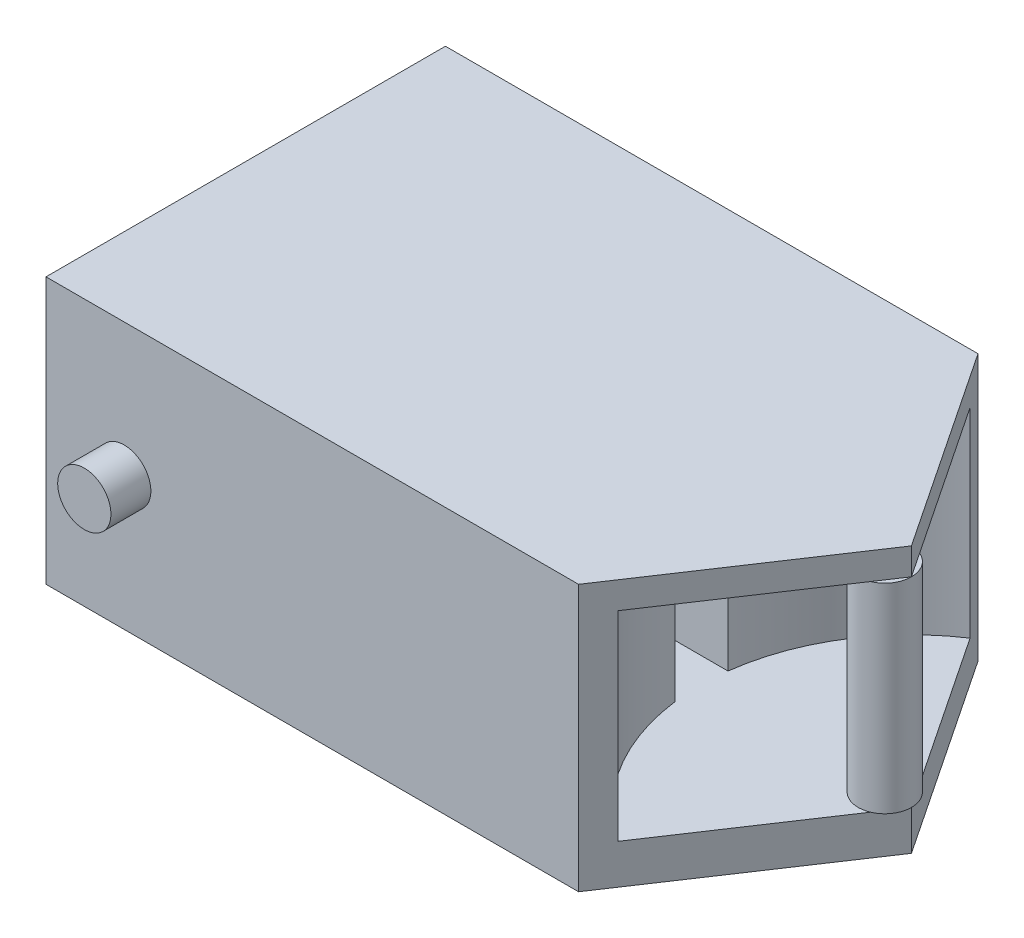
ISO-10303-21;
HEADER;
FILE_DESCRIPTION(('STEP AP214'),'2;1');
FILE_NAME('part.step','',(''),(''),'','','');
FILE_SCHEMA(('AUTOMOTIVE_DESIGN { 1 0 10303 214 1 1 1 1 }'));
ENDSEC;
DATA;
#1=APPLICATION_CONTEXT('core data for automotive mechanical design processes');
#2=APPLICATION_PROTOCOL_DEFINITION('international standard','automotive_design',2000,#1);
#3=PRODUCT_CONTEXT('',#1,'mechanical');
#4=PRODUCT('Part','Part','',(#3));
#5=PRODUCT_RELATED_PRODUCT_CATEGORY('part','',(#4));
#6=PRODUCT_DEFINITION_FORMATION('','',#4);
#7=PRODUCT_DEFINITION_CONTEXT('part definition',#1,'design');
#8=PRODUCT_DEFINITION('design','',#6,#7);
#9=PRODUCT_DEFINITION_SHAPE('','',#8);
#10=(LENGTH_UNIT() NAMED_UNIT(*) SI_UNIT(.MILLI.,.METRE.));
#11=(NAMED_UNIT(*) PLANE_ANGLE_UNIT() SI_UNIT($,.RADIAN.));
#12=(NAMED_UNIT(*) SI_UNIT($,.STERADIAN.) SOLID_ANGLE_UNIT());
#13=UNCERTAINTY_MEASURE_WITH_UNIT(LENGTH_MEASURE(1.E-05),#10,'distance_accuracy_value','');
#14=(GEOMETRIC_REPRESENTATION_CONTEXT(3) GLOBAL_UNCERTAINTY_ASSIGNED_CONTEXT((#13)) GLOBAL_UNIT_ASSIGNED_CONTEXT((#10,
#11,#12)) REPRESENTATION_CONTEXT('',''));
#15=CARTESIAN_POINT('',(0.,0.,0.));
#16=DIRECTION('',(0.,0.,1.));
#17=DIRECTION('',(1.,0.,0.));
#18=AXIS2_PLACEMENT_3D('',#15,#16,#17);
#19=CARTESIAN_POINT('',(300.,-100.,0.));
#20=DIRECTION('',(0.,-1.,0.));
#21=DIRECTION('',(0.,0.,-1.));
#22=AXIS2_PLACEMENT_3D('',#19,#20,#21);
#23=CYLINDRICAL_SURFACE('',#22,158.843097624042);
#24=CARTESIAN_POINT('',(300.,79.8602968881057,0.));
#25=DIRECTION('',(0.,-1.,0.));
#26=DIRECTION('',(0.,0.,-1.));
#27=AXIS2_PLACEMENT_3D('',#24,#25,#26);
#28=CIRCLE('',#27,158.843097624042);
#29=CARTESIAN_POINT('',(142.400642846482,79.8602968881057,-19.8386563960104));
#30=VERTEX_POINT('',#29);
#31=CARTESIAN_POINT('',(211.88970257892,79.8602968881057,-132.165446131619));
#32=VERTEX_POINT('',#31);
#33=EDGE_CURVE('E178',#30,#32,#28,.T.);
#34=ORIENTED_EDGE('',*,*,#33,.F.);
#35=DIRECTION('',(0.,-1.,0.));
#36=VECTOR('',#35,1.);
#37=CARTESIAN_POINT('',(142.400642846482,-100.,-19.8386563960104));
#38=LINE('',#37,#36);
#39=CARTESIAN_POINT('',(142.400642846482,-70.1397031118943,-19.8386563960104));
#40=VERTEX_POINT('',#39);
#41=EDGE_CURVE('E303',#30,#40,#38,.T.);
#42=ORIENTED_EDGE('',*,*,#41,.T.);
#43=CARTESIAN_POINT('',(300.,-70.1397031118943,0.));
#44=DIRECTION('',(0.,-1.,0.));
#45=DIRECTION('',(0.,0.,-1.));
#46=AXIS2_PLACEMENT_3D('',#43,#44,#45);
#47=CIRCLE('',#46,158.843097624042);
#48=CARTESIAN_POINT('',(211.88970257892,-70.1397031118943,-132.165446131619));
#49=VERTEX_POINT('',#48);
#50=EDGE_CURVE('E170',#40,#49,#47,.T.);
#51=ORIENTED_EDGE('',*,*,#50,.T.);
#52=DIRECTION('',(0.,1.,0.));
#53=VECTOR('',#52,1.);
#54=CARTESIAN_POINT('',(211.88970257892,79.8602968881057,-132.165446131619));
#55=LINE('',#54,#53);
#56=EDGE_CURVE('E287',#49,#32,#55,.T.);
#57=ORIENTED_EDGE('',*,*,#56,.T.);
#58=EDGE_LOOP('',(#34,#42,#51,#57));
#59=FACE_BOUND('',#58,.T.);
#60=ADVANCED_FACE('F39',(#59),#23,.F.);
#61=CARTESIAN_POINT('',(300.,-100.,0.));
#62=DIRECTION('',(0.832050294337844,0.,0.554700196225229));
#63=DIRECTION('',(0.554700196225229,0.,-0.832050294337844));
#64=AXIS2_PLACEMENT_3D('',#61,#62,#63);
#65=PLANE('',#64);
#66=DIRECTION('',(0.,1.,0.));
#67=VECTOR('',#66,1.);
#68=CARTESIAN_POINT('',(300.,-100.,0.));
#69=LINE('',#68,#67);
#70=CARTESIAN_POINT('',(300.,-100.,0.));
#71=VERTEX_POINT('',#70);
#72=CARTESIAN_POINT('',(300.,-70.1397031118943,0.));
#73=VERTEX_POINT('',#72);
#74=EDGE_CURVE('E168',#71,#73,#69,.T.);
#75=ORIENTED_EDGE('',*,*,#74,.T.);
#76=DIRECTION('',(-0.55470019692287,0.,0.83205029387275));
#77=VECTOR('',#76,1.);
#78=CARTESIAN_POINT('',(286.774229052692,-70.1397031118943,19.8386563849212));
#79=LINE('',#78,#77);
#80=CARTESIAN_POINT('',(287.692307661349,-70.1397031118943,18.4615384744378));
#81=VERTEX_POINT('',#80);
#82=EDGE_CURVE('E150',#73,#81,#79,.T.);
#83=ORIENTED_EDGE('',*,*,#82,.T.);
#84=CARTESIAN_POINT('',(211.889702628172,-70.1397031118943,132.165446057742));
#85=VERTEX_POINT('',#84);
#86=EDGE_CURVE('E155',#81,#85,#79,.T.);
#87=ORIENTED_EDGE('',*,*,#86,.T.);
#88=DIRECTION('',(0.,1.,0.));
#89=VECTOR('',#88,1.);
#90=CARTESIAN_POINT('',(211.889702468105,79.8602968881057,132.165446057742));
#91=LINE('',#90,#89);
#92=CARTESIAN_POINT('',(211.889702468105,79.8602968881057,132.165446057742));
#93=VERTEX_POINT('',#92);
#94=EDGE_CURVE('E277',#85,#93,#91,.T.);
#95=ORIENTED_EDGE('',*,*,#94,.T.);
#96=DIRECTION('',(0.55470019692287,0.,-0.83205029387275));
#97=VECTOR('',#96,1.);
#98=CARTESIAN_POINT('',(286.774229052692,79.8602968881057,19.8386563849212));
#99=LINE('',#98,#97);
#100=CARTESIAN_POINT('',(287.692307661349,79.8602968881057,18.4615384744379));
#101=VERTEX_POINT('',#100);
#102=EDGE_CURVE('E164',#93,#101,#99,.T.);
#103=ORIENTED_EDGE('',*,*,#102,.T.);
#104=CARTESIAN_POINT('',(300.,79.8602968881057,0.));
#105=VERTEX_POINT('',#104);
#106=EDGE_CURVE('E258',#101,#105,#99,.T.);
#107=ORIENTED_EDGE('',*,*,#106,.T.);
#108=CARTESIAN_POINT('',(300.,100.,0.));
#109=VERTEX_POINT('',#108);
#110=EDGE_CURVE('E222',#105,#109,#69,.T.);
#111=ORIENTED_EDGE('',*,*,#110,.T.);
#112=DIRECTION('',(0.554700196225229,0.,-0.832050294337844));
#113=VECTOR('',#112,1.);
#114=CARTESIAN_POINT('',(300.,100.,0.));
#115=LINE('',#114,#113);
#116=CARTESIAN_POINT('',(200.,100.,150.));
#117=VERTEX_POINT('',#116);
#118=EDGE_CURVE('E183',#117,#109,#115,.T.);
#119=ORIENTED_EDGE('',*,*,#118,.F.);
#120=DIRECTION('',(0.,1.,0.));
#121=VECTOR('',#120,1.);
#122=CARTESIAN_POINT('',(200.,-100.,150.));
#123=LINE('',#122,#121);
#124=CARTESIAN_POINT('',(200.,-100.,150.));
#125=VERTEX_POINT('',#124);
#126=EDGE_CURVE('E223',#125,#117,#123,.T.);
#127=ORIENTED_EDGE('',*,*,#126,.F.);
#128=DIRECTION('',(0.554700196225229,0.,-0.832050294337844));
#129=VECTOR('',#128,1.);
#130=CARTESIAN_POINT('',(300.,-100.,0.));
#131=LINE('',#130,#129);
#132=EDGE_CURVE('E203',#125,#71,#131,.T.);
#133=ORIENTED_EDGE('',*,*,#132,.T.);
#134=EDGE_LOOP('',(#75,#83,#87,#95,#103,#107,#111,#119,#127,#133));
#135=FACE_BOUND('',#134,.T.);
#136=ADVANCED_FACE('F41',(#135),#65,.T.);
#137=CARTESIAN_POINT('',(-200.,-100.,150.));
#138=DIRECTION('',(0.,0.,1.));
#139=DIRECTION('',(1.,0.,0.));
#140=AXIS2_PLACEMENT_3D('',#137,#138,#139);
#141=PLANE('',#140);
#142=CARTESIAN_POINT('',(-141.229513790068,0.,150.));
#143=DIRECTION('',(0.,0.,1.));
#144=DIRECTION('',(1.,0.,0.));
#145=AXIS2_PLACEMENT_3D('',#142,#143,#144);
#146=CIRCLE('',#145,20.);
#147=CARTESIAN_POINT('',(-121.229513790068,0.,150.));
#148=VERTEX_POINT('',#147);
#149=EDGE_CURVE('E48',#148,#148,#146,.T.);
#150=ORIENTED_EDGE('',*,*,#149,.F.);
#151=EDGE_LOOP('',(#150));
#152=FACE_BOUND('',#151,.T.);
#153=ORIENTED_EDGE('',*,*,#126,.T.);
#154=DIRECTION('',(1.,0.,0.));
#155=VECTOR('',#154,1.);
#156=CARTESIAN_POINT('',(-200.,100.,150.));
#157=LINE('',#156,#155);
#158=CARTESIAN_POINT('',(-200.,100.,150.));
#159=VERTEX_POINT('',#158);
#160=EDGE_CURVE('E199',#159,#117,#157,.T.);
#161=ORIENTED_EDGE('',*,*,#160,.F.);
#162=DIRECTION('',(0.,1.,0.));
#163=VECTOR('',#162,1.);
#164=CARTESIAN_POINT('',(-200.,-100.,150.));
#165=LINE('',#164,#163);
#166=CARTESIAN_POINT('',(-200.,-100.,150.));
#167=VERTEX_POINT('',#166);
#168=EDGE_CURVE('E226',#167,#159,#165,.T.);
#169=ORIENTED_EDGE('',*,*,#168,.F.);
#170=DIRECTION('',(1.,0.,0.));
#171=VECTOR('',#170,1.);
#172=CARTESIAN_POINT('',(-200.,-100.,150.));
#173=LINE('',#172,#171);
#174=EDGE_CURVE('E218',#167,#125,#173,.T.);
#175=ORIENTED_EDGE('',*,*,#174,.T.);
#176=EDGE_LOOP('',(#153,#161,#169,#175));
#177=FACE_BOUND('',#176,.T.);
#178=ADVANCED_FACE('F242',(#152,#177),#141,.T.);
#179=CARTESIAN_POINT('',(-200.,-100.,-150.));
#180=DIRECTION('',(-1.,0.,0.));
#181=DIRECTION('',(0.,0.,1.));
#182=AXIS2_PLACEMENT_3D('',#179,#180,#181);
#183=PLANE('',#182);
#184=DIRECTION('',(0.,0.,1.));
#185=VECTOR('',#184,1.);
#186=CARTESIAN_POINT('',(-200.,-70.1397031118943,19.8386563849212));
#187=LINE('',#186,#185);
#188=CARTESIAN_POINT('',(-200.,-70.1397031118943,-19.8386563960104));
#189=VERTEX_POINT('',#188);
#190=CARTESIAN_POINT('',(-200.,-70.1397031118943,19.8386563849212));
#191=VERTEX_POINT('',#190);
#192=EDGE_CURVE('E152',#189,#191,#187,.T.);
#193=ORIENTED_EDGE('',*,*,#192,.F.);
#194=DIRECTION('',(0.,-1.,0.));
#195=VECTOR('',#194,1.);
#196=CARTESIAN_POINT('',(-200.,79.8602968881057,-19.8386563960104));
#197=LINE('',#196,#195);
#198=CARTESIAN_POINT('',(-200.,79.8602968881057,-19.8386563960104));
#199=VERTEX_POINT('',#198);
#200=EDGE_CURVE('E317',#199,#189,#197,.T.);
#201=ORIENTED_EDGE('',*,*,#200,.F.);
#202=DIRECTION('',(0.,0.,-1.));
#203=VECTOR('',#202,1.);
#204=CARTESIAN_POINT('',(-200.,79.8602968881057,19.8386563849212));
#205=LINE('',#204,#203);
#206=CARTESIAN_POINT('',(-200.,79.8602968881057,19.8386563849212));
#207=VERTEX_POINT('',#206);
#208=EDGE_CURVE('E328',#207,#199,#205,.T.);
#209=ORIENTED_EDGE('',*,*,#208,.F.);
#210=DIRECTION('',(0.,1.,0.));
#211=VECTOR('',#210,1.);
#212=CARTESIAN_POINT('',(-200.,79.8602968881057,19.8386563849212));
#213=LINE('',#212,#211);
#214=EDGE_CURVE('E332',#191,#207,#213,.T.);
#215=ORIENTED_EDGE('',*,*,#214,.F.);
#216=EDGE_LOOP('',(#193,#201,#209,#215));
#217=FACE_BOUND('',#216,.T.);
#218=ORIENTED_EDGE('',*,*,#168,.T.);
#219=DIRECTION('',(0.,0.,1.));
#220=VECTOR('',#219,1.);
#221=CARTESIAN_POINT('',(-200.,100.,-150.));
#222=LINE('',#221,#220);
#223=CARTESIAN_POINT('',(-200.,100.,-150.));
#224=VERTEX_POINT('',#223);
#225=EDGE_CURVE('E195',#224,#159,#222,.T.);
#226=ORIENTED_EDGE('',*,*,#225,.F.);
#227=DIRECTION('',(0.,1.,0.));
#228=VECTOR('',#227,1.);
#229=CARTESIAN_POINT('',(-200.,-100.,-150.));
#230=LINE('',#229,#228);
#231=CARTESIAN_POINT('',(-200.,-100.,-150.));
#232=VERTEX_POINT('',#231);
#233=EDGE_CURVE('E229',#232,#224,#230,.T.);
#234=ORIENTED_EDGE('',*,*,#233,.F.);
#235=DIRECTION('',(0.,0.,1.));
#236=VECTOR('',#235,1.);
#237=CARTESIAN_POINT('',(-200.,-100.,-150.));
#238=LINE('',#237,#236);
#239=EDGE_CURVE('E214',#232,#167,#238,.T.);
#240=ORIENTED_EDGE('',*,*,#239,.T.);
#241=EDGE_LOOP('',(#218,#226,#234,#240));
#242=FACE_BOUND('',#241,.T.);
#243=ADVANCED_FACE('F245',(#217,#242),#183,.T.);
#244=CARTESIAN_POINT('',(-200.,-100.,-150.));
#245=DIRECTION('',(0.,0.,-1.));
#246=DIRECTION('',(-1.,0.,0.));
#247=AXIS2_PLACEMENT_3D('',#244,#245,#246);
#248=PLANE('',#247);
#249=CARTESIAN_POINT('',(-141.229513790068,0.,-150.));
#250=DIRECTION('',(0.,0.,-1.));
#251=DIRECTION('',(-1.,0.,0.));
#252=AXIS2_PLACEMENT_3D('',#249,#250,#251);
#253=CIRCLE('',#252,20.);
#254=CARTESIAN_POINT('',(-161.229513790068,0.,-150.));
#255=VERTEX_POINT('',#254);
#256=EDGE_CURVE('E292',#255,#255,#253,.T.);
#257=ORIENTED_EDGE('',*,*,#256,.F.);
#258=EDGE_LOOP('',(#257));
#259=FACE_BOUND('',#258,.T.);
#260=ORIENTED_EDGE('',*,*,#233,.T.);
#261=DIRECTION('',(-1.,0.,0.));
#262=VECTOR('',#261,1.);
#263=CARTESIAN_POINT('',(-200.,100.,-150.));
#264=LINE('',#263,#262);
#265=CARTESIAN_POINT('',(200.,100.,-150.));
#266=VERTEX_POINT('',#265);
#267=EDGE_CURVE('E191',#266,#224,#264,.T.);
#268=ORIENTED_EDGE('',*,*,#267,.F.);
#269=DIRECTION('',(0.,1.,0.));
#270=VECTOR('',#269,1.);
#271=CARTESIAN_POINT('',(200.,-100.,-150.));
#272=LINE('',#271,#270);
#273=CARTESIAN_POINT('',(200.,-100.,-150.));
#274=VERTEX_POINT('',#273);
#275=EDGE_CURVE('E232',#274,#266,#272,.T.);
#276=ORIENTED_EDGE('',*,*,#275,.F.);
#277=DIRECTION('',(-1.,0.,0.));
#278=VECTOR('',#277,1.);
#279=CARTESIAN_POINT('',(-200.,-100.,-150.));
#280=LINE('',#279,#278);
#281=EDGE_CURVE('E210',#274,#232,#280,.T.);
#282=ORIENTED_EDGE('',*,*,#281,.T.);
#283=EDGE_LOOP('',(#260,#268,#276,#282));
#284=FACE_BOUND('',#283,.T.);
#285=ADVANCED_FACE('F265',(#259,#284),#248,.T.);
#286=CARTESIAN_POINT('',(200.,-100.,-150.));
#287=DIRECTION('',(0.832050294337844,0.,-0.554700196225229));
#288=DIRECTION('',(-0.554700196225229,0.,-0.832050294337844));
#289=AXIS2_PLACEMENT_3D('',#286,#287,#288);
#290=PLANE('',#289);
#291=DIRECTION('',(-0.554700196225229,0.,-0.832050294337844));
#292=VECTOR('',#291,1.);
#293=CARTESIAN_POINT('',(286.774229069326,-70.1397031118943,-19.8386563960105));
#294=LINE('',#293,#292);
#295=CARTESIAN_POINT('',(287.692307692308,-70.1397031118943,-18.4615384615385));
#296=VERTEX_POINT('',#295);
#297=EDGE_CURVE('E272',#73,#296,#294,.T.);
#298=ORIENTED_EDGE('',*,*,#297,.F.);
#299=ORIENTED_EDGE('',*,*,#74,.F.);
#300=DIRECTION('',(-0.554700196225229,0.,-0.832050294337844));
#301=VECTOR('',#300,1.);
#302=CARTESIAN_POINT('',(200.,-100.,-150.));
#303=LINE('',#302,#301);
#304=EDGE_CURVE('E206',#71,#274,#303,.T.);
#305=ORIENTED_EDGE('',*,*,#304,.T.);
#306=ORIENTED_EDGE('',*,*,#275,.T.);
#307=DIRECTION('',(-0.554700196225229,0.,-0.832050294337844));
#308=VECTOR('',#307,1.);
#309=CARTESIAN_POINT('',(200.,100.,-150.));
#310=LINE('',#309,#308);
#311=EDGE_CURVE('E187',#109,#266,#310,.T.);
#312=ORIENTED_EDGE('',*,*,#311,.F.);
#313=ORIENTED_EDGE('',*,*,#110,.F.);
#314=DIRECTION('',(0.554700196225229,0.,0.832050294337844));
#315=VECTOR('',#314,1.);
#316=CARTESIAN_POINT('',(286.774229069326,79.8602968881057,-19.8386563960104));
#317=LINE('',#316,#315);
#318=CARTESIAN_POINT('',(287.692307692308,79.8602968881057,-18.4615384615385));
#319=VERTEX_POINT('',#318);
#320=EDGE_CURVE('E286',#319,#105,#317,.T.);
#321=ORIENTED_EDGE('',*,*,#320,.F.);
#322=EDGE_CURVE('E281',#32,#319,#317,.T.);
#323=ORIENTED_EDGE('',*,*,#322,.F.);
#324=ORIENTED_EDGE('',*,*,#56,.F.);
#325=EDGE_CURVE('E274',#296,#49,#294,.T.);
#326=ORIENTED_EDGE('',*,*,#325,.F.);
#327=EDGE_LOOP('',(#298,#299,#305,#306,#312,#313,#321,#323,#324,#326));
#328=FACE_BOUND('',#327,.T.);
#329=ADVANCED_FACE('F262',(#328),#290,.T.);
#330=CARTESIAN_POINT('',(0.,-100.,0.));
#331=DIRECTION('',(0.,1.,0.));
#332=DIRECTION('',(0.,0.,1.));
#333=AXIS2_PLACEMENT_3D('',#330,#331,#332);
#334=PLANE('',#333);
#335=ORIENTED_EDGE('',*,*,#132,.F.);
#336=ORIENTED_EDGE('',*,*,#174,.F.);
#337=ORIENTED_EDGE('',*,*,#239,.F.);
#338=ORIENTED_EDGE('',*,*,#281,.F.);
#339=ORIENTED_EDGE('',*,*,#304,.F.);
#340=EDGE_LOOP('',(#335,#336,#337,#338,#339));
#341=FACE_BOUND('',#340,.T.);
#342=ADVANCED_FACE('F270',(#341),#334,.F.);
#343=CARTESIAN_POINT('',(0.,100.,0.));
#344=DIRECTION('',(0.,1.,0.));
#345=DIRECTION('',(0.,0.,1.));
#346=AXIS2_PLACEMENT_3D('',#343,#344,#345);
#347=PLANE('',#346);
#348=ORIENTED_EDGE('',*,*,#118,.T.);
#349=ORIENTED_EDGE('',*,*,#311,.T.);
#350=ORIENTED_EDGE('',*,*,#267,.T.);
#351=ORIENTED_EDGE('',*,*,#225,.T.);
#352=ORIENTED_EDGE('',*,*,#160,.T.);
#353=EDGE_LOOP('',(#348,#349,#350,#351,#352));
#354=FACE_BOUND('',#353,.T.);
#355=ADVANCED_FACE('F252',(#354),#347,.T.);
#356=CARTESIAN_POINT('',(142.400642845086,-70.1397031118943,19.8386563849212));
#357=VERTEX_POINT('',#356);
#358=EDGE_CURVE('E159',#85,#357,#47,.T.);
#359=ORIENTED_EDGE('',*,*,#358,.T.);
#360=DIRECTION('',(0.,-1.,0.));
#361=VECTOR('',#360,1.);
#362=CARTESIAN_POINT('',(142.400642845086,-100.,19.8386563849212));
#363=LINE('',#362,#361);
#364=CARTESIAN_POINT('',(142.400642845086,79.8602968881057,19.8386563849212));
#365=VERTEX_POINT('',#364);
#366=EDGE_CURVE('E307',#357,#365,#363,.F.);
#367=ORIENTED_EDGE('',*,*,#366,.T.);
#368=EDGE_CURVE('E179',#93,#365,#28,.T.);
#369=ORIENTED_EDGE('',*,*,#368,.F.);
#370=ORIENTED_EDGE('',*,*,#94,.F.);
#371=EDGE_LOOP('',(#359,#367,#369,#370));
#372=FACE_BOUND('',#371,.T.);
#373=ADVANCED_FACE('F354',(#372),#23,.F.);
#374=CARTESIAN_POINT('',(286.774229052692,79.8602968881057,19.8386563849212));
#375=DIRECTION('',(0.,1.,0.));
#376=DIRECTION('',(0.,0.,1.));
#377=AXIS2_PLACEMENT_3D('',#374,#375,#376);
#378=PLANE('',#377);
#379=ORIENTED_EDGE('',*,*,#322,.T.);
#380=CARTESIAN_POINT('',(280.,79.8602968881057,0.));
#381=DIRECTION('',(0.,1.,0.));
#382=DIRECTION('',(0.,0.,1.));
#383=AXIS2_PLACEMENT_3D('',#380,#381,#382);
#384=CIRCLE('',#383,20.);
#385=EDGE_CURVE('E340',#319,#101,#384,.T.);
#386=ORIENTED_EDGE('',*,*,#385,.T.);
#387=ORIENTED_EDGE('',*,*,#102,.F.);
#388=ORIENTED_EDGE('',*,*,#368,.T.);
#389=DIRECTION('',(-1.,0.,0.));
#390=VECTOR('',#389,1.);
#391=CARTESIAN_POINT('',(300.,79.8602968881057,19.8386563849212));
#392=LINE('',#391,#390);
#393=EDGE_CURVE('E316',#365,#207,#392,.T.);
#394=ORIENTED_EDGE('',*,*,#393,.T.);
#395=ORIENTED_EDGE('',*,*,#208,.T.);
#396=DIRECTION('',(-1.,0.,0.));
#397=VECTOR('',#396,1.);
#398=CARTESIAN_POINT('',(300.,79.8602968881057,-19.8386563960104));
#399=LINE('',#398,#397);
#400=EDGE_CURVE('E320',#30,#199,#399,.T.);
#401=ORIENTED_EDGE('',*,*,#400,.F.);
#402=ORIENTED_EDGE('',*,*,#33,.T.);
#403=EDGE_LOOP('',(#379,#386,#387,#388,#394,#395,#401,#402));
#404=FACE_BOUND('',#403,.T.);
#405=ADVANCED_FACE('F349',(#404),#378,.F.);
#406=CARTESIAN_POINT('',(286.774229052692,-70.1397031118943,19.8386563849212));
#407=DIRECTION('',(0.,-1.,0.));
#408=DIRECTION('',(0.,0.,-1.));
#409=AXIS2_PLACEMENT_3D('',#406,#407,#408);
#410=PLANE('',#409);
#411=ORIENTED_EDGE('',*,*,#86,.F.);
#412=CARTESIAN_POINT('',(280.,-70.1397031118943,0.));
#413=DIRECTION('',(0.,-1.,0.));
#414=DIRECTION('',(0.,0.,-1.));
#415=AXIS2_PLACEMENT_3D('',#412,#413,#414);
#416=CIRCLE('',#415,20.);
#417=EDGE_CURVE('E11',#81,#296,#416,.T.);
#418=ORIENTED_EDGE('',*,*,#417,.T.);
#419=ORIENTED_EDGE('',*,*,#325,.T.);
#420=ORIENTED_EDGE('',*,*,#50,.F.);
#421=DIRECTION('',(-1.,0.,0.));
#422=VECTOR('',#421,1.);
#423=CARTESIAN_POINT('',(300.,-70.1397031118943,-19.8386563960105));
#424=LINE('',#423,#422);
#425=EDGE_CURVE('E311',#40,#189,#424,.T.);
#426=ORIENTED_EDGE('',*,*,#425,.T.);
#427=ORIENTED_EDGE('',*,*,#192,.T.);
#428=DIRECTION('',(-1.,0.,0.));
#429=VECTOR('',#428,1.);
#430=CARTESIAN_POINT('',(300.,-70.1397031118943,19.8386563849212));
#431=LINE('',#430,#429);
#432=EDGE_CURVE('E312',#357,#191,#431,.T.);
#433=ORIENTED_EDGE('',*,*,#432,.F.);
#434=ORIENTED_EDGE('',*,*,#358,.F.);
#435=EDGE_LOOP('',(#411,#418,#419,#420,#426,#427,#433,#434));
#436=FACE_BOUND('',#435,.T.);
#437=ADVANCED_FACE('F156',(#436),#410,.F.);
#438=CARTESIAN_POINT('',(-141.229513790068,0.,-180.));
#439=DIRECTION('',(0.,0.,1.));
#440=DIRECTION('',(1.,0.,0.));
#441=AXIS2_PLACEMENT_3D('',#438,#439,#440);
#442=CYLINDRICAL_SURFACE('',#441,20.);
#443=CARTESIAN_POINT('',(-141.229513790068,0.,-180.));
#444=DIRECTION('',(0.,0.,-1.));
#445=DIRECTION('',(-1.,0.,0.));
#446=AXIS2_PLACEMENT_3D('',#443,#444,#445);
#447=CIRCLE('',#446,20.);
#448=CARTESIAN_POINT('',(-161.229513790068,0.,-180.));
#449=VERTEX_POINT('',#448);
#450=EDGE_CURVE('E291',#449,#449,#447,.T.);
#451=ORIENTED_EDGE('',*,*,#450,.F.);
#452=EDGE_LOOP('',(#451));
#453=FACE_BOUND('',#452,.T.);
#454=ORIENTED_EDGE('',*,*,#256,.T.);
#455=EDGE_LOOP('',(#454));
#456=FACE_BOUND('',#455,.T.);
#457=ADVANCED_FACE('F431',(#453,#456),#442,.T.);
#458=CARTESIAN_POINT('',(-141.229513790068,0.,-180.));
#459=DIRECTION('',(0.,0.,-1.));
#460=DIRECTION('',(-1.,0.,0.));
#461=AXIS2_PLACEMENT_3D('',#458,#459,#460);
#462=PLANE('',#461);
#463=ORIENTED_EDGE('',*,*,#450,.T.);
#464=EDGE_LOOP('',(#463));
#465=FACE_BOUND('',#464,.T.);
#466=ADVANCED_FACE('F436',(#465),#462,.T.);
#467=CARTESIAN_POINT('',(-141.229513790068,0.,180.));
#468=DIRECTION('',(0.,0.,-1.));
#469=DIRECTION('',(-1.,0.,0.));
#470=AXIS2_PLACEMENT_3D('',#467,#468,#469);
#471=CYLINDRICAL_SURFACE('',#470,20.);
#472=CARTESIAN_POINT('',(-141.229513790068,0.,180.));
#473=DIRECTION('',(0.,0.,-1.));
#474=DIRECTION('',(-1.,0.,0.));
#475=AXIS2_PLACEMENT_3D('',#472,#473,#474);
#476=CIRCLE('',#475,20.);
#477=CARTESIAN_POINT('',(-161.229513790068,0.,180.));
#478=VERTEX_POINT('',#477);
#479=EDGE_CURVE('E296',#478,#478,#476,.T.);
#480=ORIENTED_EDGE('',*,*,#479,.T.);
#481=EDGE_LOOP('',(#480));
#482=FACE_BOUND('',#481,.T.);
#483=ORIENTED_EDGE('',*,*,#149,.T.);
#484=EDGE_LOOP('',(#483));
#485=FACE_BOUND('',#484,.T.);
#486=ADVANCED_FACE('F240',(#482,#485),#471,.T.);
#487=CARTESIAN_POINT('',(-141.229513790068,0.,180.));
#488=DIRECTION('',(0.,0.,1.));
#489=DIRECTION('',(-1.,0.,0.));
#490=AXIS2_PLACEMENT_3D('',#487,#488,#489);
#491=PLANE('',#490);
#492=ORIENTED_EDGE('',*,*,#479,.F.);
#493=EDGE_LOOP('',(#492));
#494=FACE_BOUND('',#493,.T.);
#495=ADVANCED_FACE('F463',(#494),#491,.T.);
#496=CARTESIAN_POINT('',(300.,79.8602968881057,-19.8386563960104));
#497=DIRECTION('',(0.,0.,-1.));
#498=DIRECTION('',(0.,1.,0.));
#499=AXIS2_PLACEMENT_3D('',#496,#497,#498);
#500=PLANE('',#499);
#501=ORIENTED_EDGE('',*,*,#400,.T.);
#502=ORIENTED_EDGE('',*,*,#200,.T.);
#503=ORIENTED_EDGE('',*,*,#425,.F.);
#504=ORIENTED_EDGE('',*,*,#41,.F.);
#505=EDGE_LOOP('',(#501,#502,#503,#504));
#506=FACE_BOUND('',#505,.T.);
#507=ADVANCED_FACE('F364',(#506),#500,.F.);
#508=CARTESIAN_POINT('',(300.,79.8602968881057,19.8386563849212));
#509=DIRECTION('',(0.,0.,1.));
#510=DIRECTION('',(1.,0.,0.));
#511=AXIS2_PLACEMENT_3D('',#508,#509,#510);
#512=PLANE('',#511);
#513=ORIENTED_EDGE('',*,*,#432,.T.);
#514=ORIENTED_EDGE('',*,*,#214,.T.);
#515=ORIENTED_EDGE('',*,*,#393,.F.);
#516=ORIENTED_EDGE('',*,*,#366,.F.);
#517=EDGE_LOOP('',(#513,#514,#515,#516));
#518=FACE_BOUND('',#517,.T.);
#519=ADVANCED_FACE('F360',(#518),#512,.F.);
#520=CARTESIAN_POINT('',(300.,-70.1397031118943,0.));
#521=DIRECTION('',(0.,-1.,0.));
#522=DIRECTION('',(0.,0.,-1.));
#523=AXIS2_PLACEMENT_3D('',#520,#521,#522);
#524=PLANE('',#523);
#525=CARTESIAN_POINT('',(280.,-70.1397031118943,0.));
#526=DIRECTION('',(0.,1.,0.));
#527=DIRECTION('',(0.,0.,1.));
#528=AXIS2_PLACEMENT_3D('',#525,#526,#527);
#529=CIRCLE('',#528,20.);
#530=EDGE_CURVE('E142',#81,#73,#529,.T.);
#531=ORIENTED_EDGE('',*,*,#530,.F.);
#532=ORIENTED_EDGE('',*,*,#82,.F.);
#533=EDGE_LOOP('',(#531,#532));
#534=FACE_BOUND('',#533,.T.);
#535=ADVANCED_FACE('F148',(#534),#524,.T.);
#536=CARTESIAN_POINT('',(300.,79.8602968881057,0.));
#537=DIRECTION('',(0.,-1.,0.));
#538=DIRECTION('',(0.,0.,-1.));
#539=AXIS2_PLACEMENT_3D('',#536,#537,#538);
#540=PLANE('',#539);
#541=ORIENTED_EDGE('',*,*,#106,.F.);
#542=EDGE_CURVE('E55',#101,#105,#384,.T.);
#543=ORIENTED_EDGE('',*,*,#542,.T.);
#544=EDGE_LOOP('',(#541,#543));
#545=FACE_BOUND('',#544,.T.);
#546=ADVANCED_FACE('F380',(#545),#540,.F.);
#547=EDGE_CURVE('E63',#73,#296,#529,.T.);
#548=ORIENTED_EDGE('',*,*,#547,.F.);
#549=ORIENTED_EDGE('',*,*,#297,.T.);
#550=EDGE_LOOP('',(#548,#549));
#551=FACE_BOUND('',#550,.T.);
#552=ADVANCED_FACE('F373',(#551),#524,.T.);
#553=CARTESIAN_POINT('',(280.,79.8602968881057,0.));
#554=DIRECTION('',(0.,1.,0.));
#555=DIRECTION('',(0.,0.,1.));
#556=AXIS2_PLACEMENT_3D('',#553,#554,#555);
#557=CYLINDRICAL_SURFACE('',#556,20.);
#558=ORIENTED_EDGE('',*,*,#530,.T.);
#559=ORIENTED_EDGE('',*,*,#547,.T.);
#560=ORIENTED_EDGE('',*,*,#417,.F.);
#561=EDGE_LOOP('',(#558,#559,#560));
#562=FACE_BOUND('',#561,.T.);
#563=ORIENTED_EDGE('',*,*,#542,.F.);
#564=ORIENTED_EDGE('',*,*,#385,.F.);
#565=EDGE_CURVE('E339',#105,#319,#384,.T.);
#566=ORIENTED_EDGE('',*,*,#565,.F.);
#567=EDGE_LOOP('',(#563,#564,#566));
#568=FACE_BOUND('',#567,.T.);
#569=ADVANCED_FACE('F141',(#562,#568),#557,.T.);
#570=ORIENTED_EDGE('',*,*,#320,.T.);
#571=ORIENTED_EDGE('',*,*,#565,.T.);
#572=EDGE_LOOP('',(#570,#571));
#573=FACE_BOUND('',#572,.T.);
#574=ADVANCED_FACE('F371',(#573),#540,.F.);
#575=CLOSED_SHELL('',(#60,#136,#178,#243,#285,#329,#342,#355,#373,#405,#437,#457,#466,#486,#495,
#507,#519,#535,#546,#552,#569,#574));
#576=MANIFOLD_SOLID_BREP('B2',#575);
#577=ADVANCED_BREP_SHAPE_REPRESENTATION('',(#18,#576),#14);
#578=SHAPE_DEFINITION_REPRESENTATION(#9,#577);
ENDSEC;
END-ISO-10303-21;
